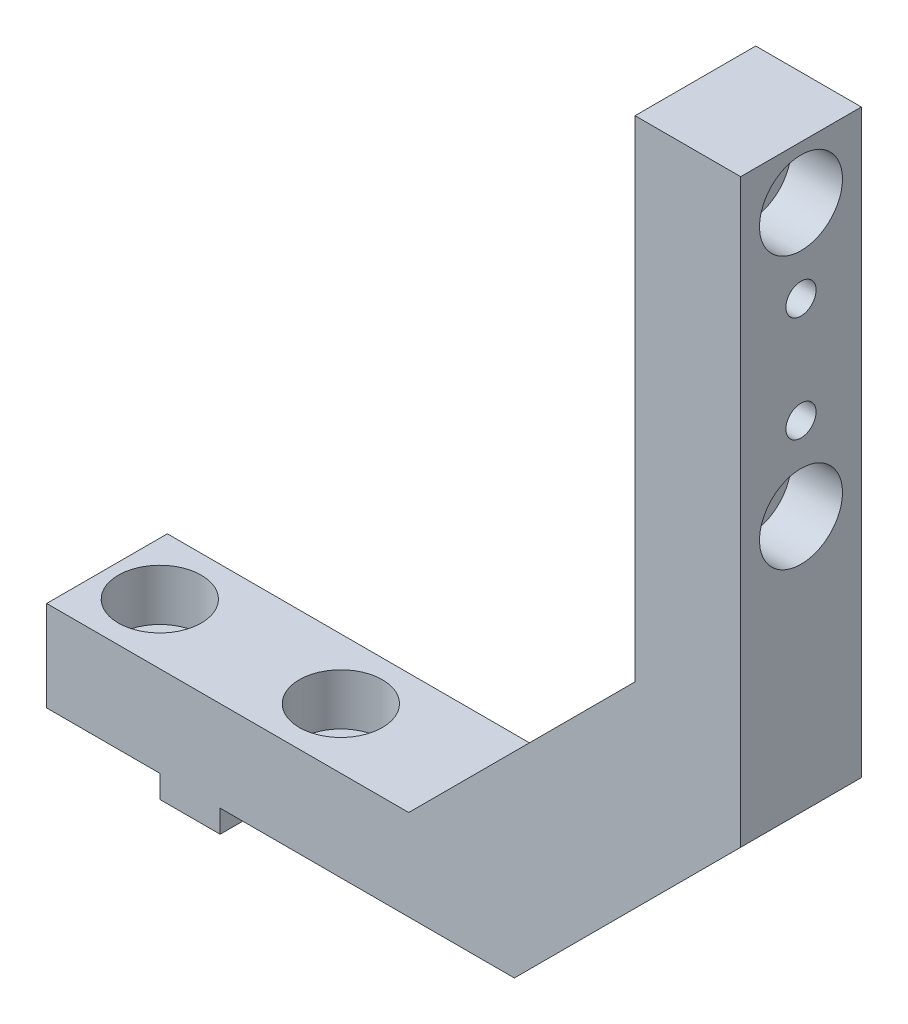
ISO-10303-21;
HEADER;
FILE_DESCRIPTION(('STEP AP214'),'2;1');
FILE_NAME('part.step','',(''),(''),'','','');
FILE_SCHEMA(('AUTOMOTIVE_DESIGN { 1 0 10303 214 1 1 1 1 }'));
ENDSEC;
DATA;
#1=APPLICATION_CONTEXT('core data for automotive mechanical design processes');
#2=APPLICATION_PROTOCOL_DEFINITION('international standard','automotive_design',2000,#1);
#3=PRODUCT_CONTEXT('',#1,'mechanical');
#4=PRODUCT('Part','Part','',(#3));
#5=PRODUCT_RELATED_PRODUCT_CATEGORY('part','',(#4));
#6=PRODUCT_DEFINITION_FORMATION('','',#4);
#7=PRODUCT_DEFINITION_CONTEXT('part definition',#1,'design');
#8=PRODUCT_DEFINITION('design','',#6,#7);
#9=PRODUCT_DEFINITION_SHAPE('','',#8);
#10=(LENGTH_UNIT() NAMED_UNIT(*) SI_UNIT(.MILLI.,.METRE.));
#11=(NAMED_UNIT(*) PLANE_ANGLE_UNIT() SI_UNIT($,.RADIAN.));
#12=(NAMED_UNIT(*) SI_UNIT($,.STERADIAN.) SOLID_ANGLE_UNIT());
#13=UNCERTAINTY_MEASURE_WITH_UNIT(LENGTH_MEASURE(1.E-05),#10,'distance_accuracy_value','');
#14=(GEOMETRIC_REPRESENTATION_CONTEXT(3) GLOBAL_UNCERTAINTY_ASSIGNED_CONTEXT((#13)) GLOBAL_UNIT_ASSIGNED_CONTEXT((#10,
#11,#12)) REPRESENTATION_CONTEXT('',''));
#15=CARTESIAN_POINT('',(0.,0.,0.));
#16=DIRECTION('',(0.,0.,1.));
#17=DIRECTION('',(1.,0.,0.));
#18=AXIS2_PLACEMENT_3D('',#15,#16,#17);
#19=CARTESIAN_POINT('',(0.,0.,0.));
#20=DIRECTION('',(0.,-1.,0.));
#21=DIRECTION('',(0.,0.,-1.));
#22=AXIS2_PLACEMENT_3D('',#19,#20,#21);
#23=PLANE('',#22);
#24=CARTESIAN_POINT('',(-39.,0.,0.));
#25=DIRECTION('',(0.,-1.,0.));
#26=DIRECTION('',(0.,0.,-1.));
#27=AXIS2_PLACEMENT_3D('',#24,#25,#26);
#28=CIRCLE('',#27,3.3);
#29=CARTESIAN_POINT('',(-39.,0.,-3.3));
#30=VERTEX_POINT('',#29);
#31=EDGE_CURVE('E174',#30,#30,#28,.T.);
#32=ORIENTED_EDGE('',*,*,#31,.F.);
#33=EDGE_LOOP('',(#32));
#34=FACE_BOUND('',#33,.T.);
#35=DIRECTION('',(0.,0.,-1.));
#36=VECTOR('',#35,1.);
#37=CARTESIAN_POINT('',(-31.,0.,8.));
#38=LINE('',#37,#36);
#39=CARTESIAN_POINT('',(-31.,0.,8.));
#40=VERTEX_POINT('',#39);
#41=CARTESIAN_POINT('',(-31.,0.,-8.));
#42=VERTEX_POINT('',#41);
#43=EDGE_CURVE('E128',#40,#42,#38,.T.);
#44=ORIENTED_EDGE('',*,*,#43,.F.);
#45=DIRECTION('',(1.,0.,0.));
#46=VECTOR('',#45,1.);
#47=CARTESIAN_POINT('',(-46.,0.,8.));
#48=LINE('',#47,#46);
#49=CARTESIAN_POINT('',(-46.,0.,8.));
#50=VERTEX_POINT('',#49);
#51=EDGE_CURVE('E263',#50,#40,#48,.T.);
#52=ORIENTED_EDGE('',*,*,#51,.F.);
#53=DIRECTION('',(0.,0.,1.));
#54=VECTOR('',#53,1.);
#55=CARTESIAN_POINT('',(-46.,0.,8.));
#56=LINE('',#55,#54);
#57=CARTESIAN_POINT('',(-46.,0.,-8.));
#58=VERTEX_POINT('',#57);
#59=EDGE_CURVE('E290',#58,#50,#56,.T.);
#60=ORIENTED_EDGE('',*,*,#59,.F.);
#61=DIRECTION('',(-1.,0.,0.));
#62=VECTOR('',#61,1.);
#63=CARTESIAN_POINT('',(-46.,0.,-8.));
#64=LINE('',#63,#62);
#65=EDGE_CURVE('E156',#42,#58,#64,.T.);
#66=ORIENTED_EDGE('',*,*,#65,.F.);
#67=EDGE_LOOP('',(#44,#52,#60,#66));
#68=FACE_BOUND('',#67,.T.);
#69=ADVANCED_FACE('F17',(#34,#68),#23,.T.);
#70=CARTESIAN_POINT('',(0.,12.,0.));
#71=DIRECTION('',(0.,-1.,0.));
#72=DIRECTION('',(0.,0.,-1.));
#73=AXIS2_PLACEMENT_3D('',#70,#71,#72);
#74=PLANE('',#73);
#75=CARTESIAN_POINT('',(-39.,12.,0.));
#76=DIRECTION('',(0.,1.,0.));
#77=DIRECTION('',(0.,0.,1.));
#78=AXIS2_PLACEMENT_3D('',#75,#76,#77);
#79=CIRCLE('',#78,5.5);
#80=CARTESIAN_POINT('',(-39.,12.,5.5));
#81=VERTEX_POINT('',#80);
#82=EDGE_CURVE('E181',#81,#81,#79,.T.);
#83=ORIENTED_EDGE('',*,*,#82,.F.);
#84=EDGE_LOOP('',(#83));
#85=FACE_BOUND('',#84,.T.);
#86=CARTESIAN_POINT('',(-15.,12.,0.));
#87=DIRECTION('',(0.,1.,0.));
#88=DIRECTION('',(0.,0.,1.));
#89=AXIS2_PLACEMENT_3D('',#86,#87,#88);
#90=CIRCLE('',#89,5.5);
#91=CARTESIAN_POINT('',(-15.,12.,5.5));
#92=VERTEX_POINT('',#91);
#93=EDGE_CURVE('E171',#92,#92,#90,.T.);
#94=ORIENTED_EDGE('',*,*,#93,.F.);
#95=EDGE_LOOP('',(#94));
#96=FACE_BOUND('',#95,.T.);
#97=DIRECTION('',(1.,0.,0.));
#98=VECTOR('',#97,1.);
#99=CARTESIAN_POINT('',(-46.,12.,8.));
#100=LINE('',#99,#98);
#101=CARTESIAN_POINT('',(-46.,12.,8.));
#102=VERTEX_POINT('',#101);
#103=CARTESIAN_POINT('',(2.00000000000012,12.,8.));
#104=VERTEX_POINT('',#103);
#105=EDGE_CURVE('E271',#102,#104,#100,.T.);
#106=ORIENTED_EDGE('',*,*,#105,.T.);
#107=DIRECTION('',(0.,0.,-1.));
#108=VECTOR('',#107,1.);
#109=CARTESIAN_POINT('',(2.00000000000012,12.,-8.));
#110=LINE('',#109,#108);
#111=CARTESIAN_POINT('',(2.00000000000012,12.,-8.));
#112=VERTEX_POINT('',#111);
#113=EDGE_CURVE('E251',#104,#112,#110,.T.);
#114=ORIENTED_EDGE('',*,*,#113,.T.);
#115=DIRECTION('',(-1.,0.,0.));
#116=VECTOR('',#115,1.);
#117=CARTESIAN_POINT('',(-46.,12.,-8.));
#118=LINE('',#117,#116);
#119=CARTESIAN_POINT('',(-46.,12.,-8.));
#120=VERTEX_POINT('',#119);
#121=EDGE_CURVE('E260',#112,#120,#118,.T.);
#122=ORIENTED_EDGE('',*,*,#121,.T.);
#123=DIRECTION('',(0.,0.,1.));
#124=VECTOR('',#123,1.);
#125=CARTESIAN_POINT('',(-46.,12.,8.));
#126=LINE('',#125,#124);
#127=EDGE_CURVE('E262',#120,#102,#126,.T.);
#128=ORIENTED_EDGE('',*,*,#127,.T.);
#129=EDGE_LOOP('',(#106,#114,#122,#128));
#130=FACE_BOUND('',#129,.T.);
#131=ADVANCED_FACE('F321',(#85,#96,#130),#74,.F.);
#132=CARTESIAN_POINT('',(46.,12.,8.));
#133=DIRECTION('',(-1.,0.,0.));
#134=DIRECTION('',(0.,0.,1.));
#135=AXIS2_PLACEMENT_3D('',#132,#133,#134);
#136=PLANE('',#135);
#137=CARTESIAN_POINT('',(46.,75.,0.));
#138=DIRECTION('',(-1.,0.,0.));
#139=DIRECTION('',(0.,0.,1.));
#140=AXIS2_PLACEMENT_3D('',#137,#138,#139);
#141=CIRCLE('',#140,2.);
#142=CARTESIAN_POINT('',(46.,75.,2.));
#143=VERTEX_POINT('',#142);
#144=EDGE_CURVE('E209',#143,#143,#141,.T.);
#145=ORIENTED_EDGE('',*,*,#144,.T.);
#146=EDGE_LOOP('',(#145));
#147=FACE_BOUND('',#146,.T.);
#148=CARTESIAN_POINT('',(46.,89.,0.));
#149=DIRECTION('',(-1.,0.,0.));
#150=DIRECTION('',(0.,0.,1.));
#151=AXIS2_PLACEMENT_3D('',#148,#149,#150);
#152=CIRCLE('',#151,2.);
#153=CARTESIAN_POINT('',(46.,89.,2.));
#154=VERTEX_POINT('',#153);
#155=EDGE_CURVE('E203',#154,#154,#152,.T.);
#156=ORIENTED_EDGE('',*,*,#155,.T.);
#157=EDGE_LOOP('',(#156));
#158=FACE_BOUND('',#157,.T.);
#159=CARTESIAN_POINT('',(46.,100.,0.));
#160=DIRECTION('',(1.,0.,0.));
#161=DIRECTION('',(0.,0.,-1.));
#162=AXIS2_PLACEMENT_3D('',#159,#160,#161);
#163=CIRCLE('',#162,5.5);
#164=CARTESIAN_POINT('',(46.,100.,-5.5));
#165=VERTEX_POINT('',#164);
#166=EDGE_CURVE('E200',#165,#165,#163,.T.);
#167=ORIENTED_EDGE('',*,*,#166,.F.);
#168=EDGE_LOOP('',(#167));
#169=FACE_BOUND('',#168,.T.);
#170=CARTESIAN_POINT('',(46.,64.,0.));
#171=DIRECTION('',(1.,0.,0.));
#172=DIRECTION('',(0.,0.,-1.));
#173=AXIS2_PLACEMENT_3D('',#170,#171,#172);
#174=CIRCLE('',#173,5.5);
#175=CARTESIAN_POINT('',(46.,64.,-5.50000000000001));
#176=VERTEX_POINT('',#175);
#177=EDGE_CURVE('E191',#176,#176,#174,.T.);
#178=ORIENTED_EDGE('',*,*,#177,.F.);
#179=EDGE_LOOP('',(#178));
#180=FACE_BOUND('',#179,.T.);
#181=DIRECTION('',(0.,-1.,0.));
#182=VECTOR('',#181,1.);
#183=CARTESIAN_POINT('',(46.,12.,8.));
#184=LINE('',#183,#182);
#185=CARTESIAN_POINT('',(46.,107.,8.));
#186=VERTEX_POINT('',#185);
#187=CARTESIAN_POINT('',(46.,30.,8.));
#188=VERTEX_POINT('',#187);
#189=EDGE_CURVE('E278',#186,#188,#184,.T.);
#190=ORIENTED_EDGE('',*,*,#189,.T.);
#191=DIRECTION('',(0.,0.,-1.));
#192=VECTOR('',#191,1.);
#193=CARTESIAN_POINT('',(46.,30.,-8.));
#194=LINE('',#193,#192);
#195=CARTESIAN_POINT('',(46.,30.,-8.));
#196=VERTEX_POINT('',#195);
#197=EDGE_CURVE('E311',#188,#196,#194,.T.);
#198=ORIENTED_EDGE('',*,*,#197,.T.);
#199=DIRECTION('',(0.,-1.,0.));
#200=VECTOR('',#199,1.);
#201=CARTESIAN_POINT('',(46.,12.,-8.));
#202=LINE('',#201,#200);
#203=CARTESIAN_POINT('',(46.,107.,-8.));
#204=VERTEX_POINT('',#203);
#205=EDGE_CURVE('E252',#204,#196,#202,.T.);
#206=ORIENTED_EDGE('',*,*,#205,.F.);
#207=DIRECTION('',(0.,0.,-1.));
#208=VECTOR('',#207,1.);
#209=CARTESIAN_POINT('',(46.,107.,-8.));
#210=LINE('',#209,#208);
#211=EDGE_CURVE('E129',#186,#204,#210,.T.);
#212=ORIENTED_EDGE('',*,*,#211,.F.);
#213=EDGE_LOOP('',(#190,#198,#206,#212));
#214=FACE_BOUND('',#213,.T.);
#215=ADVANCED_FACE('F323',(#147,#158,#169,#180,#214),#136,.F.);
#216=CARTESIAN_POINT('',(-46.,12.,-8.));
#217=DIRECTION('',(0.,0.,1.));
#218=DIRECTION('',(1.,0.,0.));
#219=AXIS2_PLACEMENT_3D('',#216,#217,#218);
#220=PLANE('',#219);
#221=ORIENTED_EDGE('',*,*,#205,.T.);
#222=DIRECTION('',(-0.707106781186549,-0.707106781186546,0.));
#223=VECTOR('',#222,1.);
#224=CARTESIAN_POINT('',(46.,30.,-8.));
#225=LINE('',#224,#223);
#226=CARTESIAN_POINT('',(16.,0.,-8.));
#227=VERTEX_POINT('',#226);
#228=EDGE_CURVE('E41',#196,#227,#225,.T.);
#229=ORIENTED_EDGE('',*,*,#228,.T.);
#230=CARTESIAN_POINT('',(-23.,0.,-8.));
#231=VERTEX_POINT('',#230);
#232=EDGE_CURVE('E306',#227,#231,#64,.T.);
#233=ORIENTED_EDGE('',*,*,#232,.T.);
#234=DIRECTION('',(0.,1.,0.));
#235=VECTOR('',#234,1.);
#236=CARTESIAN_POINT('',(-23.,-3.,-8.));
#237=LINE('',#236,#235);
#238=CARTESIAN_POINT('',(-23.,-3.,-8.));
#239=VERTEX_POINT('',#238);
#240=EDGE_CURVE('E112',#239,#231,#237,.T.);
#241=ORIENTED_EDGE('',*,*,#240,.F.);
#242=DIRECTION('',(1.,0.,0.));
#243=VECTOR('',#242,1.);
#244=CARTESIAN_POINT('',(-31.,-3.,-8.));
#245=LINE('',#244,#243);
#246=CARTESIAN_POINT('',(-31.,-3.,-8.));
#247=VERTEX_POINT('',#246);
#248=EDGE_CURVE('E105',#247,#239,#245,.T.);
#249=ORIENTED_EDGE('',*,*,#248,.F.);
#250=DIRECTION('',(0.,1.,0.));
#251=VECTOR('',#250,1.);
#252=CARTESIAN_POINT('',(-31.,-3.,-8.));
#253=LINE('',#252,#251);
#254=EDGE_CURVE('E109',#247,#42,#253,.T.);
#255=ORIENTED_EDGE('',*,*,#254,.T.);
#256=ORIENTED_EDGE('',*,*,#65,.T.);
#257=DIRECTION('',(0.,-1.,0.));
#258=VECTOR('',#257,1.);
#259=CARTESIAN_POINT('',(-46.,12.,-8.));
#260=LINE('',#259,#258);
#261=EDGE_CURVE('E255',#120,#58,#260,.T.);
#262=ORIENTED_EDGE('',*,*,#261,.F.);
#263=ORIENTED_EDGE('',*,*,#121,.F.);
#264=DIRECTION('',(-0.707106781186544,-0.707106781186551,0.));
#265=VECTOR('',#264,1.);
#266=CARTESIAN_POINT('',(-21.9999999999997,-12.,-8.));
#267=LINE('',#266,#265);
#268=CARTESIAN_POINT('',(32.,42.,-8.));
#269=VERTEX_POINT('',#268);
#270=EDGE_CURVE('E249',#112,#269,#267,.F.);
#271=ORIENTED_EDGE('',*,*,#270,.T.);
#272=DIRECTION('',(0.,-1.,0.));
#273=VECTOR('',#272,1.);
#274=CARTESIAN_POINT('',(32.,107.,-8.));
#275=LINE('',#274,#273);
#276=CARTESIAN_POINT('',(32.,107.,-8.));
#277=VERTEX_POINT('',#276);
#278=EDGE_CURVE('E236',#277,#269,#275,.T.);
#279=ORIENTED_EDGE('',*,*,#278,.F.);
#280=DIRECTION('',(-1.,0.,0.));
#281=VECTOR('',#280,1.);
#282=CARTESIAN_POINT('',(46.,107.,-8.));
#283=LINE('',#282,#281);
#284=EDGE_CURVE('E132',#204,#277,#283,.T.);
#285=ORIENTED_EDGE('',*,*,#284,.F.);
#286=EDGE_LOOP('',(#221,#229,#233,#241,#249,#255,#256,#262,#263,#271,#279,#285));
#287=FACE_BOUND('',#286,.T.);
#288=ADVANCED_FACE('F107',(#287),#220,.F.);
#289=CARTESIAN_POINT('',(-46.,12.,8.));
#290=DIRECTION('',(1.,0.,0.));
#291=DIRECTION('',(0.,0.,-1.));
#292=AXIS2_PLACEMENT_3D('',#289,#290,#291);
#293=PLANE('',#292);
#294=ORIENTED_EDGE('',*,*,#59,.T.);
#295=DIRECTION('',(0.,-1.,0.));
#296=VECTOR('',#295,1.);
#297=CARTESIAN_POINT('',(-46.,12.,8.));
#298=LINE('',#297,#296);
#299=EDGE_CURVE('E294',#102,#50,#298,.T.);
#300=ORIENTED_EDGE('',*,*,#299,.F.);
#301=ORIENTED_EDGE('',*,*,#127,.F.);
#302=ORIENTED_EDGE('',*,*,#261,.T.);
#303=EDGE_LOOP('',(#294,#300,#301,#302));
#304=FACE_BOUND('',#303,.T.);
#305=ADVANCED_FACE('F301',(#304),#293,.F.);
#306=CARTESIAN_POINT('',(-46.,12.,8.));
#307=DIRECTION('',(0.,0.,-1.));
#308=DIRECTION('',(-1.,0.,0.));
#309=AXIS2_PLACEMENT_3D('',#306,#307,#308);
#310=PLANE('',#309);
#311=CARTESIAN_POINT('',(-23.,0.,8.));
#312=VERTEX_POINT('',#311);
#313=CARTESIAN_POINT('',(16.,0.,8.));
#314=VERTEX_POINT('',#313);
#315=EDGE_CURVE('E287',#312,#314,#48,.T.);
#316=ORIENTED_EDGE('',*,*,#315,.T.);
#317=DIRECTION('',(0.707106781186549,0.707106781186546,0.));
#318=VECTOR('',#317,1.);
#319=CARTESIAN_POINT('',(46.,30.,8.));
#320=LINE('',#319,#318);
#321=EDGE_CURVE('E11',#314,#188,#320,.T.);
#322=ORIENTED_EDGE('',*,*,#321,.T.);
#323=ORIENTED_EDGE('',*,*,#189,.F.);
#324=DIRECTION('',(1.,0.,0.));
#325=VECTOR('',#324,1.);
#326=CARTESIAN_POINT('',(46.,107.,8.));
#327=LINE('',#326,#325);
#328=CARTESIAN_POINT('',(32.,107.,8.));
#329=VERTEX_POINT('',#328);
#330=EDGE_CURVE('E268',#329,#186,#327,.T.);
#331=ORIENTED_EDGE('',*,*,#330,.F.);
#332=DIRECTION('',(0.,-1.,0.));
#333=VECTOR('',#332,1.);
#334=CARTESIAN_POINT('',(32.,107.,8.));
#335=LINE('',#334,#333);
#336=CARTESIAN_POINT('',(32.,42.,8.));
#337=VERTEX_POINT('',#336);
#338=EDGE_CURVE('E243',#329,#337,#335,.T.);
#339=ORIENTED_EDGE('',*,*,#338,.T.);
#340=DIRECTION('',(0.707106781186544,0.707106781186551,0.));
#341=VECTOR('',#340,1.);
#342=CARTESIAN_POINT('',(-21.9999999999997,-12.,8.));
#343=LINE('',#342,#341);
#344=EDGE_CURVE('E250',#337,#104,#343,.F.);
#345=ORIENTED_EDGE('',*,*,#344,.T.);
#346=ORIENTED_EDGE('',*,*,#105,.F.);
#347=ORIENTED_EDGE('',*,*,#299,.T.);
#348=ORIENTED_EDGE('',*,*,#51,.T.);
#349=DIRECTION('',(0.,1.,0.));
#350=VECTOR('',#349,1.);
#351=CARTESIAN_POINT('',(-31.,-3.,8.));
#352=LINE('',#351,#350);
#353=CARTESIAN_POINT('',(-31.,-3.,8.));
#354=VERTEX_POINT('',#353);
#355=EDGE_CURVE('E144',#354,#40,#352,.T.);
#356=ORIENTED_EDGE('',*,*,#355,.F.);
#357=DIRECTION('',(-1.,0.,0.));
#358=VECTOR('',#357,1.);
#359=CARTESIAN_POINT('',(-31.,-3.,8.));
#360=LINE('',#359,#358);
#361=CARTESIAN_POINT('',(-23.,-3.,8.));
#362=VERTEX_POINT('',#361);
#363=EDGE_CURVE('E121',#362,#354,#360,.T.);
#364=ORIENTED_EDGE('',*,*,#363,.F.);
#365=DIRECTION('',(0.,1.,0.));
#366=VECTOR('',#365,1.);
#367=CARTESIAN_POINT('',(-23.,-3.,8.));
#368=LINE('',#367,#366);
#369=EDGE_CURVE('E134',#362,#312,#368,.T.);
#370=ORIENTED_EDGE('',*,*,#369,.T.);
#371=EDGE_LOOP('',(#316,#322,#323,#331,#339,#345,#346,#347,#348,#356,#364,#370));
#372=FACE_BOUND('',#371,.T.);
#373=ADVANCED_FACE('F318',(#372),#310,.F.);
#374=CARTESIAN_POINT('',(-15.,0.,0.));
#375=DIRECTION('',(0.,-1.,0.));
#376=DIRECTION('',(0.,0.,-1.));
#377=AXIS2_PLACEMENT_3D('',#374,#375,#376);
#378=CIRCLE('',#377,3.3);
#379=CARTESIAN_POINT('',(-15.,0.,-3.3));
#380=VERTEX_POINT('',#379);
#381=EDGE_CURVE('E143',#380,#380,#378,.T.);
#382=ORIENTED_EDGE('',*,*,#381,.F.);
#383=EDGE_LOOP('',(#382));
#384=FACE_BOUND('',#383,.T.);
#385=ORIENTED_EDGE('',*,*,#232,.F.);
#386=DIRECTION('',(0.,0.,1.));
#387=VECTOR('',#386,1.);
#388=CARTESIAN_POINT('',(16.,0.,8.));
#389=LINE('',#388,#387);
#390=EDGE_CURVE('E26',#227,#314,#389,.T.);
#391=ORIENTED_EDGE('',*,*,#390,.T.);
#392=ORIENTED_EDGE('',*,*,#315,.F.);
#393=DIRECTION('',(0.,0.,1.));
#394=VECTOR('',#393,1.);
#395=CARTESIAN_POINT('',(-23.,0.,8.));
#396=LINE('',#395,#394);
#397=EDGE_CURVE('E125',#231,#312,#396,.T.);
#398=ORIENTED_EDGE('',*,*,#397,.F.);
#399=EDGE_LOOP('',(#385,#391,#392,#398));
#400=FACE_BOUND('',#399,.T.);
#401=ADVANCED_FACE('F222',(#384,#400),#23,.T.);
#402=CARTESIAN_POINT('',(32.,107.,-8.));
#403=DIRECTION('',(1.,0.,0.));
#404=DIRECTION('',(0.,0.,-1.));
#405=AXIS2_PLACEMENT_3D('',#402,#403,#404);
#406=PLANE('',#405);
#407=CARTESIAN_POINT('',(32.,75.,0.));
#408=DIRECTION('',(-1.,0.,0.));
#409=DIRECTION('',(0.,0.,1.));
#410=AXIS2_PLACEMENT_3D('',#407,#408,#409);
#411=CIRCLE('',#410,2.);
#412=CARTESIAN_POINT('',(32.,75.,2.));
#413=VERTEX_POINT('',#412);
#414=EDGE_CURVE('E212',#413,#413,#411,.T.);
#415=ORIENTED_EDGE('',*,*,#414,.F.);
#416=EDGE_LOOP('',(#415));
#417=FACE_BOUND('',#416,.T.);
#418=CARTESIAN_POINT('',(32.,89.,0.));
#419=DIRECTION('',(-1.,0.,0.));
#420=DIRECTION('',(0.,0.,1.));
#421=AXIS2_PLACEMENT_3D('',#418,#419,#420);
#422=CIRCLE('',#421,2.);
#423=CARTESIAN_POINT('',(32.,89.,2.));
#424=VERTEX_POINT('',#423);
#425=EDGE_CURVE('E206',#424,#424,#422,.T.);
#426=ORIENTED_EDGE('',*,*,#425,.F.);
#427=EDGE_LOOP('',(#426));
#428=FACE_BOUND('',#427,.T.);
#429=CARTESIAN_POINT('',(32.,100.,0.));
#430=DIRECTION('',(1.,0.,0.));
#431=DIRECTION('',(0.,0.,-1.));
#432=AXIS2_PLACEMENT_3D('',#429,#430,#431);
#433=CIRCLE('',#432,3.3);
#434=CARTESIAN_POINT('',(32.,100.,-3.3));
#435=VERTEX_POINT('',#434);
#436=EDGE_CURVE('E21',#435,#435,#433,.T.);
#437=ORIENTED_EDGE('',*,*,#436,.T.);
#438=EDGE_LOOP('',(#437));
#439=FACE_BOUND('',#438,.T.);
#440=CARTESIAN_POINT('',(32.,64.,0.));
#441=DIRECTION('',(1.,0.,0.));
#442=DIRECTION('',(0.,0.,-1.));
#443=AXIS2_PLACEMENT_3D('',#440,#441,#442);
#444=CIRCLE('',#443,3.3);
#445=CARTESIAN_POINT('',(32.,64.,-3.30000000000001));
#446=VERTEX_POINT('',#445);
#447=EDGE_CURVE('E184',#446,#446,#444,.T.);
#448=ORIENTED_EDGE('',*,*,#447,.T.);
#449=EDGE_LOOP('',(#448));
#450=FACE_BOUND('',#449,.T.);
#451=ORIENTED_EDGE('',*,*,#278,.T.);
#452=DIRECTION('',(0.,0.,1.));
#453=VECTOR('',#452,1.);
#454=CARTESIAN_POINT('',(32.,42.,8.));
#455=LINE('',#454,#453);
#456=EDGE_CURVE('E239',#269,#337,#455,.T.);
#457=ORIENTED_EDGE('',*,*,#456,.T.);
#458=ORIENTED_EDGE('',*,*,#338,.F.);
#459=DIRECTION('',(0.,0.,1.));
#460=VECTOR('',#459,1.);
#461=CARTESIAN_POINT('',(32.,107.,-8.));
#462=LINE('',#461,#460);
#463=EDGE_CURVE('E241',#277,#329,#462,.T.);
#464=ORIENTED_EDGE('',*,*,#463,.F.);
#465=EDGE_LOOP('',(#451,#457,#458,#464));
#466=FACE_BOUND('',#465,.T.);
#467=ADVANCED_FACE('F218',(#417,#428,#439,#450,#466),#406,.F.);
#468=CARTESIAN_POINT('',(0.,107.,0.));
#469=DIRECTION('',(0.,-1.,0.));
#470=DIRECTION('',(0.,0.,-1.));
#471=AXIS2_PLACEMENT_3D('',#468,#469,#470);
#472=PLANE('',#471);
#473=ORIENTED_EDGE('',*,*,#211,.T.);
#474=ORIENTED_EDGE('',*,*,#284,.T.);
#475=ORIENTED_EDGE('',*,*,#463,.T.);
#476=ORIENTED_EDGE('',*,*,#330,.T.);
#477=EDGE_LOOP('',(#473,#474,#475,#476));
#478=FACE_BOUND('',#477,.T.);
#479=ADVANCED_FACE('F221',(#478),#472,.F.);
#480=CARTESIAN_POINT('',(-31.,-3.,8.));
#481=DIRECTION('',(1.,0.,0.));
#482=DIRECTION('',(0.,0.,-1.));
#483=AXIS2_PLACEMENT_3D('',#480,#481,#482);
#484=PLANE('',#483);
#485=ORIENTED_EDGE('',*,*,#43,.T.);
#486=ORIENTED_EDGE('',*,*,#254,.F.);
#487=DIRECTION('',(0.,0.,-1.));
#488=VECTOR('',#487,1.);
#489=CARTESIAN_POINT('',(-31.,-3.,8.));
#490=LINE('',#489,#488);
#491=EDGE_CURVE('E116',#354,#247,#490,.T.);
#492=ORIENTED_EDGE('',*,*,#491,.F.);
#493=ORIENTED_EDGE('',*,*,#355,.T.);
#494=EDGE_LOOP('',(#485,#486,#492,#493));
#495=FACE_BOUND('',#494,.T.);
#496=ADVANCED_FACE('F127',(#495),#484,.F.);
#497=CARTESIAN_POINT('',(-23.,-3.,8.));
#498=DIRECTION('',(-1.,0.,0.));
#499=DIRECTION('',(0.,0.,1.));
#500=AXIS2_PLACEMENT_3D('',#497,#498,#499);
#501=PLANE('',#500);
#502=ORIENTED_EDGE('',*,*,#397,.T.);
#503=ORIENTED_EDGE('',*,*,#369,.F.);
#504=DIRECTION('',(0.,0.,1.));
#505=VECTOR('',#504,1.);
#506=CARTESIAN_POINT('',(-23.,-3.,8.));
#507=LINE('',#506,#505);
#508=EDGE_CURVE('E115',#239,#362,#507,.T.);
#509=ORIENTED_EDGE('',*,*,#508,.F.);
#510=ORIENTED_EDGE('',*,*,#240,.T.);
#511=EDGE_LOOP('',(#502,#503,#509,#510));
#512=FACE_BOUND('',#511,.T.);
#513=ADVANCED_FACE('F388',(#512),#501,.F.);
#514=CARTESIAN_POINT('',(0.,-3.,0.));
#515=DIRECTION('',(0.,-1.,0.));
#516=DIRECTION('',(0.,0.,-1.));
#517=AXIS2_PLACEMENT_3D('',#514,#515,#516);
#518=PLANE('',#517);
#519=ORIENTED_EDGE('',*,*,#491,.T.);
#520=ORIENTED_EDGE('',*,*,#248,.T.);
#521=ORIENTED_EDGE('',*,*,#508,.T.);
#522=ORIENTED_EDGE('',*,*,#363,.T.);
#523=EDGE_LOOP('',(#519,#520,#521,#522));
#524=FACE_BOUND('',#523,.T.);
#525=ADVANCED_FACE('F119',(#524),#518,.T.);
#526=CARTESIAN_POINT('',(-15.,12.,0.));
#527=DIRECTION('',(0.,1.,0.));
#528=DIRECTION('',(0.,0.,1.));
#529=AXIS2_PLACEMENT_3D('',#526,#527,#528);
#530=CYLINDRICAL_SURFACE('',#529,3.3);
#531=ORIENTED_EDGE('',*,*,#381,.T.);
#532=EDGE_LOOP('',(#531));
#533=FACE_BOUND('',#532,.T.);
#534=CARTESIAN_POINT('',(-15.,5.2,0.));
#535=DIRECTION('',(0.,1.,0.));
#536=DIRECTION('',(0.,0.,1.));
#537=AXIS2_PLACEMENT_3D('',#534,#535,#536);
#538=CIRCLE('',#537,3.3);
#539=CARTESIAN_POINT('',(-15.,5.2,3.3));
#540=VERTEX_POINT('',#539);
#541=EDGE_CURVE('E165',#540,#540,#538,.T.);
#542=ORIENTED_EDGE('',*,*,#541,.T.);
#543=EDGE_LOOP('',(#542));
#544=FACE_BOUND('',#543,.T.);
#545=ADVANCED_FACE('F381',(#533,#544),#530,.F.);
#546=CARTESIAN_POINT('',(-11.7,5.2,0.));
#547=DIRECTION('',(0.,-1.,0.));
#548=DIRECTION('',(0.,0.,-1.));
#549=AXIS2_PLACEMENT_3D('',#546,#547,#548);
#550=PLANE('',#549);
#551=ORIENTED_EDGE('',*,*,#541,.F.);
#552=EDGE_LOOP('',(#551));
#553=FACE_BOUND('',#552,.T.);
#554=CARTESIAN_POINT('',(-15.,5.2,0.));
#555=DIRECTION('',(0.,1.,0.));
#556=DIRECTION('',(0.,0.,1.));
#557=AXIS2_PLACEMENT_3D('',#554,#555,#556);
#558=CIRCLE('',#557,5.5);
#559=CARTESIAN_POINT('',(-15.,5.2,5.5));
#560=VERTEX_POINT('',#559);
#561=EDGE_CURVE('E168',#560,#560,#558,.T.);
#562=ORIENTED_EDGE('',*,*,#561,.T.);
#563=EDGE_LOOP('',(#562));
#564=FACE_BOUND('',#563,.T.);
#565=ADVANCED_FACE('F377',(#553,#564),#550,.F.);
#566=CARTESIAN_POINT('',(-15.,12.,0.));
#567=DIRECTION('',(0.,1.,0.));
#568=DIRECTION('',(0.,0.,1.));
#569=AXIS2_PLACEMENT_3D('',#566,#567,#568);
#570=CYLINDRICAL_SURFACE('',#569,5.5);
#571=ORIENTED_EDGE('',*,*,#561,.F.);
#572=EDGE_LOOP('',(#571));
#573=FACE_BOUND('',#572,.T.);
#574=ORIENTED_EDGE('',*,*,#93,.T.);
#575=EDGE_LOOP('',(#574));
#576=FACE_BOUND('',#575,.T.);
#577=ADVANCED_FACE('F373',(#573,#576),#570,.F.);
#578=CARTESIAN_POINT('',(-39.,12.,0.));
#579=DIRECTION('',(0.,1.,0.));
#580=DIRECTION('',(0.,0.,1.));
#581=AXIS2_PLACEMENT_3D('',#578,#579,#580);
#582=CYLINDRICAL_SURFACE('',#581,3.3);
#583=ORIENTED_EDGE('',*,*,#31,.T.);
#584=EDGE_LOOP('',(#583));
#585=FACE_BOUND('',#584,.T.);
#586=CARTESIAN_POINT('',(-39.,5.2,0.));
#587=DIRECTION('',(0.,1.,0.));
#588=DIRECTION('',(0.,0.,1.));
#589=AXIS2_PLACEMENT_3D('',#586,#587,#588);
#590=CIRCLE('',#589,3.3);
#591=CARTESIAN_POINT('',(-39.,5.2,3.3));
#592=VERTEX_POINT('',#591);
#593=EDGE_CURVE('E175',#592,#592,#590,.T.);
#594=ORIENTED_EDGE('',*,*,#593,.T.);
#595=EDGE_LOOP('',(#594));
#596=FACE_BOUND('',#595,.T.);
#597=ADVANCED_FACE('F363',(#585,#596),#582,.F.);
#598=CARTESIAN_POINT('',(-35.7,5.2,0.));
#599=DIRECTION('',(0.,-1.,0.));
#600=DIRECTION('',(0.,0.,-1.));
#601=AXIS2_PLACEMENT_3D('',#598,#599,#600);
#602=PLANE('',#601);
#603=ORIENTED_EDGE('',*,*,#593,.F.);
#604=EDGE_LOOP('',(#603));
#605=FACE_BOUND('',#604,.T.);
#606=CARTESIAN_POINT('',(-39.,5.2,0.));
#607=DIRECTION('',(0.,1.,0.));
#608=DIRECTION('',(0.,0.,1.));
#609=AXIS2_PLACEMENT_3D('',#606,#607,#608);
#610=CIRCLE('',#609,5.5);
#611=CARTESIAN_POINT('',(-39.,5.2,5.5));
#612=VERTEX_POINT('',#611);
#613=EDGE_CURVE('E178',#612,#612,#610,.T.);
#614=ORIENTED_EDGE('',*,*,#613,.T.);
#615=EDGE_LOOP('',(#614));
#616=FACE_BOUND('',#615,.T.);
#617=ADVANCED_FACE('F356',(#605,#616),#602,.F.);
#618=CARTESIAN_POINT('',(-39.,12.,0.));
#619=DIRECTION('',(0.,1.,0.));
#620=DIRECTION('',(0.,0.,1.));
#621=AXIS2_PLACEMENT_3D('',#618,#619,#620);
#622=CYLINDRICAL_SURFACE('',#621,5.5);
#623=ORIENTED_EDGE('',*,*,#613,.F.);
#624=EDGE_LOOP('',(#623));
#625=FACE_BOUND('',#624,.T.);
#626=ORIENTED_EDGE('',*,*,#82,.T.);
#627=EDGE_LOOP('',(#626));
#628=FACE_BOUND('',#627,.T.);
#629=ADVANCED_FACE('F348',(#625,#628),#622,.F.);
#630=CARTESIAN_POINT('',(32.,42.,-8.));
#631=DIRECTION('',(-0.707106781186551,0.707106781186544,0.));
#632=DIRECTION('',(0.,0.,-1.));
#633=AXIS2_PLACEMENT_3D('',#630,#631,#632);
#634=PLANE('',#633);
#635=ORIENTED_EDGE('',*,*,#270,.F.);
#636=ORIENTED_EDGE('',*,*,#113,.F.);
#637=ORIENTED_EDGE('',*,*,#344,.F.);
#638=ORIENTED_EDGE('',*,*,#456,.F.);
#639=EDGE_LOOP('',(#635,#636,#637,#638));
#640=FACE_BOUND('',#639,.T.);
#641=ADVANCED_FACE('F247',(#640),#634,.T.);
#642=CARTESIAN_POINT('',(46.,30.,8.));
#643=DIRECTION('',(0.707106781186546,-0.707106781186549,0.));
#644=DIRECTION('',(0.,0.,1.));
#645=AXIS2_PLACEMENT_3D('',#642,#643,#644);
#646=PLANE('',#645);
#647=ORIENTED_EDGE('',*,*,#321,.F.);
#648=ORIENTED_EDGE('',*,*,#390,.F.);
#649=ORIENTED_EDGE('',*,*,#228,.F.);
#650=ORIENTED_EDGE('',*,*,#197,.F.);
#651=EDGE_LOOP('',(#647,#648,#649,#650));
#652=FACE_BOUND('',#651,.T.);
#653=ADVANCED_FACE('F19',(#652),#646,.T.);
#654=CARTESIAN_POINT('',(46.,64.,0.));
#655=DIRECTION('',(1.,0.,0.));
#656=DIRECTION('',(0.,0.,-1.));
#657=AXIS2_PLACEMENT_3D('',#654,#655,#656);
#658=CYLINDRICAL_SURFACE('',#657,3.3);
#659=CARTESIAN_POINT('',(39.2,64.,0.));
#660=DIRECTION('',(1.,0.,0.));
#661=DIRECTION('',(0.,0.,-1.));
#662=AXIS2_PLACEMENT_3D('',#659,#660,#661);
#663=CIRCLE('',#662,3.3);
#664=CARTESIAN_POINT('',(39.2,64.,-3.30000000000001));
#665=VERTEX_POINT('',#664);
#666=EDGE_CURVE('E185',#665,#665,#663,.T.);
#667=ORIENTED_EDGE('',*,*,#666,.T.);
#668=EDGE_LOOP('',(#667));
#669=FACE_BOUND('',#668,.T.);
#670=ORIENTED_EDGE('',*,*,#447,.F.);
#671=EDGE_LOOP('',(#670));
#672=FACE_BOUND('',#671,.T.);
#673=ADVANCED_FACE('F354',(#669,#672),#658,.F.);
#674=CARTESIAN_POINT('',(39.2,67.3,0.));
#675=DIRECTION('',(-1.,0.,0.));
#676=DIRECTION('',(0.,0.,1.));
#677=AXIS2_PLACEMENT_3D('',#674,#675,#676);
#678=PLANE('',#677);
#679=ORIENTED_EDGE('',*,*,#666,.F.);
#680=EDGE_LOOP('',(#679));
#681=FACE_BOUND('',#680,.T.);
#682=CARTESIAN_POINT('',(39.2,64.,0.));
#683=DIRECTION('',(1.,0.,0.));
#684=DIRECTION('',(0.,0.,-1.));
#685=AXIS2_PLACEMENT_3D('',#682,#683,#684);
#686=CIRCLE('',#685,5.5);
#687=CARTESIAN_POINT('',(39.2,64.,-5.50000000000001));
#688=VERTEX_POINT('',#687);
#689=EDGE_CURVE('E188',#688,#688,#686,.T.);
#690=ORIENTED_EDGE('',*,*,#689,.T.);
#691=EDGE_LOOP('',(#690));
#692=FACE_BOUND('',#691,.T.);
#693=ADVANCED_FACE('F470',(#681,#692),#678,.F.);
#694=CARTESIAN_POINT('',(46.,64.,0.));
#695=DIRECTION('',(1.,0.,0.));
#696=DIRECTION('',(0.,0.,-1.));
#697=AXIS2_PLACEMENT_3D('',#694,#695,#696);
#698=CYLINDRICAL_SURFACE('',#697,5.5);
#699=ORIENTED_EDGE('',*,*,#689,.F.);
#700=EDGE_LOOP('',(#699));
#701=FACE_BOUND('',#700,.T.);
#702=ORIENTED_EDGE('',*,*,#177,.T.);
#703=EDGE_LOOP('',(#702));
#704=FACE_BOUND('',#703,.T.);
#705=ADVANCED_FACE('F479',(#701,#704),#698,.F.);
#706=CARTESIAN_POINT('',(46.,100.,0.));
#707=DIRECTION('',(1.,0.,0.));
#708=DIRECTION('',(0.,0.,-1.));
#709=AXIS2_PLACEMENT_3D('',#706,#707,#708);
#710=CYLINDRICAL_SURFACE('',#709,3.3);
#711=CARTESIAN_POINT('',(39.2,100.,0.));
#712=DIRECTION('',(1.,0.,0.));
#713=DIRECTION('',(0.,0.,-1.));
#714=AXIS2_PLACEMENT_3D('',#711,#712,#713);
#715=CIRCLE('',#714,3.3);
#716=CARTESIAN_POINT('',(39.2,100.,-3.3));
#717=VERTEX_POINT('',#716);
#718=EDGE_CURVE('E194',#717,#717,#715,.T.);
#719=ORIENTED_EDGE('',*,*,#718,.T.);
#720=EDGE_LOOP('',(#719));
#721=FACE_BOUND('',#720,.T.);
#722=ORIENTED_EDGE('',*,*,#436,.F.);
#723=EDGE_LOOP('',(#722));
#724=FACE_BOUND('',#723,.T.);
#725=ADVANCED_FACE('F488',(#721,#724),#710,.F.);
#726=CARTESIAN_POINT('',(39.2,103.3,0.));
#727=DIRECTION('',(-1.,0.,0.));
#728=DIRECTION('',(0.,0.,1.));
#729=AXIS2_PLACEMENT_3D('',#726,#727,#728);
#730=PLANE('',#729);
#731=ORIENTED_EDGE('',*,*,#718,.F.);
#732=EDGE_LOOP('',(#731));
#733=FACE_BOUND('',#732,.T.);
#734=CARTESIAN_POINT('',(39.2,100.,0.));
#735=DIRECTION('',(1.,0.,0.));
#736=DIRECTION('',(0.,0.,-1.));
#737=AXIS2_PLACEMENT_3D('',#734,#735,#736);
#738=CIRCLE('',#737,5.5);
#739=CARTESIAN_POINT('',(39.2,100.,-5.5));
#740=VERTEX_POINT('',#739);
#741=EDGE_CURVE('E197',#740,#740,#738,.T.);
#742=ORIENTED_EDGE('',*,*,#741,.T.);
#743=EDGE_LOOP('',(#742));
#744=FACE_BOUND('',#743,.T.);
#745=ADVANCED_FACE('F498',(#733,#744),#730,.F.);
#746=CARTESIAN_POINT('',(46.,100.,0.));
#747=DIRECTION('',(1.,0.,0.));
#748=DIRECTION('',(0.,0.,-1.));
#749=AXIS2_PLACEMENT_3D('',#746,#747,#748);
#750=CYLINDRICAL_SURFACE('',#749,5.5);
#751=ORIENTED_EDGE('',*,*,#741,.F.);
#752=EDGE_LOOP('',(#751));
#753=FACE_BOUND('',#752,.T.);
#754=ORIENTED_EDGE('',*,*,#166,.T.);
#755=EDGE_LOOP('',(#754));
#756=FACE_BOUND('',#755,.T.);
#757=ADVANCED_FACE('F508',(#753,#756),#750,.F.);
#758=CARTESIAN_POINT('',(32.,89.,0.));
#759=DIRECTION('',(-1.,0.,0.));
#760=DIRECTION('',(0.,0.,1.));
#761=AXIS2_PLACEMENT_3D('',#758,#759,#760);
#762=CYLINDRICAL_SURFACE('',#761,2.);
#763=ORIENTED_EDGE('',*,*,#155,.F.);
#764=EDGE_LOOP('',(#763));
#765=FACE_BOUND('',#764,.T.);
#766=ORIENTED_EDGE('',*,*,#425,.T.);
#767=EDGE_LOOP('',(#766));
#768=FACE_BOUND('',#767,.T.);
#769=ADVANCED_FACE('F518',(#765,#768),#762,.F.);
#770=CARTESIAN_POINT('',(32.,75.,0.));
#771=DIRECTION('',(-1.,0.,0.));
#772=DIRECTION('',(0.,0.,1.));
#773=AXIS2_PLACEMENT_3D('',#770,#771,#772);
#774=CYLINDRICAL_SURFACE('',#773,2.);
#775=ORIENTED_EDGE('',*,*,#144,.F.);
#776=EDGE_LOOP('',(#775));
#777=FACE_BOUND('',#776,.T.);
#778=ORIENTED_EDGE('',*,*,#414,.T.);
#779=EDGE_LOOP('',(#778));
#780=FACE_BOUND('',#779,.T.);
#781=ADVANCED_FACE('F216',(#777,#780),#774,.F.);
#782=CLOSED_SHELL('',(#69,#131,#215,#288,#305,#373,#401,#467,#479,#496,#513,#525,#545,#565,#577,
#597,#617,#629,#641,#653,#673,#693,#705,#725,#745,#757,#769,#781));
#783=MANIFOLD_SOLID_BREP('B1',#782);
#784=ADVANCED_BREP_SHAPE_REPRESENTATION('',(#18,#783),#14);
#785=SHAPE_DEFINITION_REPRESENTATION(#9,#784);
ENDSEC;
END-ISO-10303-21;
